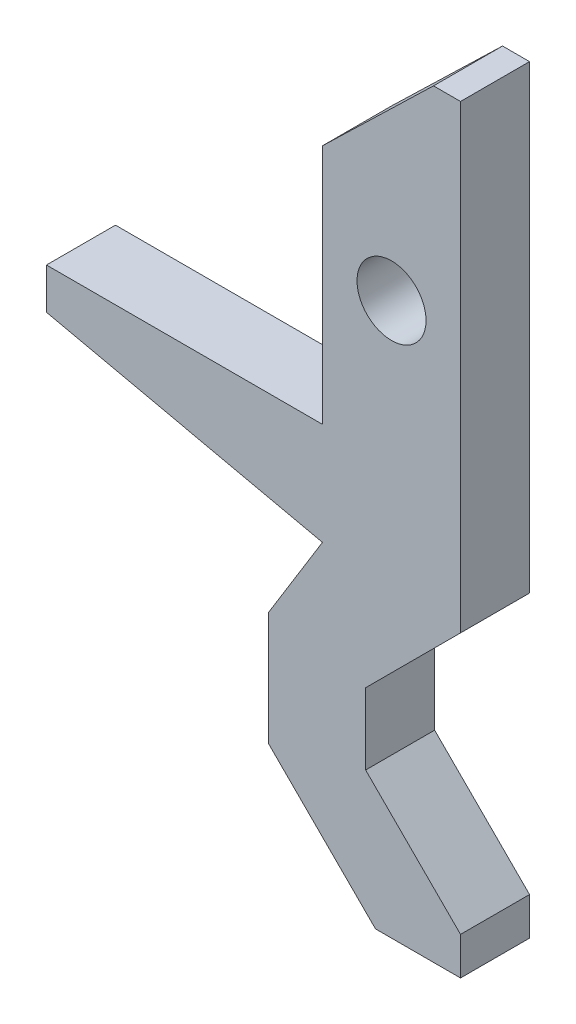
ISO-10303-21;
HEADER;
FILE_DESCRIPTION(('STEP AP214'),'2;1');
FILE_NAME('part.step','',(''),(''),'','','');
FILE_SCHEMA(('AUTOMOTIVE_DESIGN { 1 0 10303 214 1 1 1 1 }'));
ENDSEC;
DATA;
#1=APPLICATION_CONTEXT('core data for automotive mechanical design processes');
#2=APPLICATION_PROTOCOL_DEFINITION('international standard','automotive_design',2000,#1);
#3=PRODUCT_CONTEXT('',#1,'mechanical');
#4=PRODUCT('Part','Part','',(#3));
#5=PRODUCT_RELATED_PRODUCT_CATEGORY('part','',(#4));
#6=PRODUCT_DEFINITION_FORMATION('','',#4);
#7=PRODUCT_DEFINITION_CONTEXT('part definition',#1,'design');
#8=PRODUCT_DEFINITION('design','',#6,#7);
#9=PRODUCT_DEFINITION_SHAPE('','',#8);
#10=(LENGTH_UNIT() NAMED_UNIT(*) SI_UNIT(.MILLI.,.METRE.));
#11=(NAMED_UNIT(*) PLANE_ANGLE_UNIT() SI_UNIT($,.RADIAN.));
#12=(NAMED_UNIT(*) SI_UNIT($,.STERADIAN.) SOLID_ANGLE_UNIT());
#13=UNCERTAINTY_MEASURE_WITH_UNIT(LENGTH_MEASURE(1.E-05),#10,'distance_accuracy_value','');
#14=(GEOMETRIC_REPRESENTATION_CONTEXT(3) GLOBAL_UNCERTAINTY_ASSIGNED_CONTEXT((#13)) GLOBAL_UNIT_ASSIGNED_CONTEXT((#10,
#11,#12)) REPRESENTATION_CONTEXT('',''));
#15=CARTESIAN_POINT('',(0.,0.,0.));
#16=DIRECTION('',(0.,0.,1.));
#17=DIRECTION('',(1.,0.,0.));
#18=AXIS2_PLACEMENT_3D('',#15,#16,#17);
#19=CARTESIAN_POINT('',(-5.,0.,5.));
#20=DIRECTION('',(-1.,0.,0.));
#21=DIRECTION('',(0.,0.,1.));
#22=AXIS2_PLACEMENT_3D('',#19,#20,#21);
#23=PLANE('',#22);
#24=DIRECTION('',(0.,1.,0.));
#25=VECTOR('',#24,1.);
#26=CARTESIAN_POINT('',(-5.,0.,0.));
#27=LINE('',#26,#25);
#28=CARTESIAN_POINT('',(-5.,0.,0.));
#29=VERTEX_POINT('',#28);
#30=CARTESIAN_POINT('',(-5.,7.22018760925899,0.));
#31=VERTEX_POINT('',#30);
#32=EDGE_CURVE('E180',#29,#31,#27,.T.);
#33=ORIENTED_EDGE('',*,*,#32,.F.);
#34=DIRECTION('',(0.,0.,-1.));
#35=VECTOR('',#34,1.);
#36=CARTESIAN_POINT('',(-5.,0.,5.));
#37=LINE('',#36,#35);
#38=CARTESIAN_POINT('',(-5.,0.,5.));
#39=VERTEX_POINT('',#38);
#40=EDGE_CURVE('E11',#39,#29,#37,.T.);
#41=ORIENTED_EDGE('',*,*,#40,.F.);
#42=DIRECTION('',(0.,1.,0.));
#43=VECTOR('',#42,1.);
#44=CARTESIAN_POINT('',(-5.,0.,5.));
#45=LINE('',#44,#43);
#46=CARTESIAN_POINT('',(-5.,7.22018760925899,5.));
#47=VERTEX_POINT('',#46);
#48=EDGE_CURVE('E227',#39,#47,#45,.T.);
#49=ORIENTED_EDGE('',*,*,#48,.T.);
#50=DIRECTION('',(0.,0.,-1.));
#51=VECTOR('',#50,1.);
#52=CARTESIAN_POINT('',(-5.,7.22018760925899,5.));
#53=LINE('',#52,#51);
#54=EDGE_CURVE('E51',#47,#31,#53,.T.);
#55=ORIENTED_EDGE('',*,*,#54,.T.);
#56=EDGE_LOOP('',(#33,#41,#49,#55));
#57=FACE_BOUND('',#56,.T.);
#58=ADVANCED_FACE('F35',(#57),#23,.T.);
#59=CARTESIAN_POINT('',(-4.99999999680664,-0.000126359749041714,5.));
#60=DIRECTION('',(-0.999999999680664,-2.52719498164131E-05,0.));
#61=DIRECTION('',(2.52719498164131E-05,-0.999999999680664,0.));
#62=AXIS2_PLACEMENT_3D('',#59,#60,#61);
#63=PLANE('',#62);
#64=DIRECTION('',(-2.52719498164131E-05,0.999999999680664,0.));
#65=VECTOR('',#64,1.);
#66=CARTESIAN_POINT('',(-4.99999999680664,-0.000126359749041714,0.));
#67=LINE('',#66,#65);
#68=CARTESIAN_POINT('',(-4.99974066429336,-10.2618004720861,0.));
#69=VERTEX_POINT('',#68);
#70=EDGE_CURVE('E182',#69,#29,#67,.T.);
#71=ORIENTED_EDGE('',*,*,#70,.F.);
#72=DIRECTION('',(0.,0.,-1.));
#73=VECTOR('',#72,1.);
#74=CARTESIAN_POINT('',(-4.99974066429336,-10.2618004720861,5.));
#75=LINE('',#74,#73);
#76=CARTESIAN_POINT('',(-4.99974066429336,-10.2618004720861,5.));
#77=VERTEX_POINT('',#76);
#78=EDGE_CURVE('E43',#77,#69,#75,.T.);
#79=ORIENTED_EDGE('',*,*,#78,.F.);
#80=DIRECTION('',(-2.52719498164131E-05,0.999999999680664,0.));
#81=VECTOR('',#80,1.);
#82=CARTESIAN_POINT('',(-4.99999999680664,-0.000126359749041714,5.));
#83=LINE('',#82,#81);
#84=EDGE_CURVE('E273',#77,#39,#83,.T.);
#85=ORIENTED_EDGE('',*,*,#84,.T.);
#86=ORIENTED_EDGE('',*,*,#40,.T.);
#87=EDGE_LOOP('',(#71,#79,#85,#86));
#88=FACE_BOUND('',#87,.T.);
#89=ADVANCED_FACE('F260',(#88),#63,.T.);
#90=CARTESIAN_POINT('',(0.,-10.2618004720861,5.));
#91=DIRECTION('',(0.,1.,0.));
#92=DIRECTION('',(0.,0.,1.));
#93=AXIS2_PLACEMENT_3D('',#90,#91,#92);
#94=PLANE('',#93);
#95=DIRECTION('',(1.,0.,0.));
#96=VECTOR('',#95,1.);
#97=CARTESIAN_POINT('',(0.,-10.2618004720861,0.));
#98=LINE('',#97,#96);
#99=CARTESIAN_POINT('',(-25.,-10.2618004720861,0.));
#100=VERTEX_POINT('',#99);
#101=EDGE_CURVE('E185',#100,#69,#98,.T.);
#102=ORIENTED_EDGE('',*,*,#101,.F.);
#103=DIRECTION('',(0.,0.,-1.));
#104=VECTOR('',#103,1.);
#105=CARTESIAN_POINT('',(-25.,-10.2618004720861,5.));
#106=LINE('',#105,#104);
#107=CARTESIAN_POINT('',(-25.,-10.2618004720861,5.));
#108=VERTEX_POINT('',#107);
#109=EDGE_CURVE('E249',#108,#100,#106,.T.);
#110=ORIENTED_EDGE('',*,*,#109,.F.);
#111=DIRECTION('',(1.,0.,0.));
#112=VECTOR('',#111,1.);
#113=CARTESIAN_POINT('',(0.,-10.2618004720861,5.));
#114=LINE('',#113,#112);
#115=EDGE_CURVE('E256',#108,#77,#114,.T.);
#116=ORIENTED_EDGE('',*,*,#115,.T.);
#117=ORIENTED_EDGE('',*,*,#78,.T.);
#118=EDGE_LOOP('',(#102,#110,#116,#117));
#119=FACE_BOUND('',#118,.T.);
#120=ADVANCED_FACE('F254',(#119),#94,.T.);
#121=CARTESIAN_POINT('',(-25.,0.,5.));
#122=DIRECTION('',(-1.,0.,0.));
#123=DIRECTION('',(0.,0.,1.));
#124=AXIS2_PLACEMENT_3D('',#121,#122,#123);
#125=PLANE('',#124);
#126=DIRECTION('',(0.,1.,0.));
#127=VECTOR('',#126,1.);
#128=CARTESIAN_POINT('',(-25.,0.,0.));
#129=LINE('',#128,#127);
#130=CARTESIAN_POINT('',(-25.,-13.2318791793819,0.));
#131=VERTEX_POINT('',#130);
#132=EDGE_CURVE('E188',#131,#100,#129,.T.);
#133=ORIENTED_EDGE('',*,*,#132,.F.);
#134=DIRECTION('',(0.,0.,-1.));
#135=VECTOR('',#134,1.);
#136=CARTESIAN_POINT('',(-25.,-13.2318791793819,5.));
#137=LINE('',#136,#135);
#138=CARTESIAN_POINT('',(-25.,-13.2318791793819,5.));
#139=VERTEX_POINT('',#138);
#140=EDGE_CURVE('E247',#139,#131,#137,.T.);
#141=ORIENTED_EDGE('',*,*,#140,.F.);
#142=DIRECTION('',(0.,1.,0.));
#143=VECTOR('',#142,1.);
#144=CARTESIAN_POINT('',(-25.,0.,5.));
#145=LINE('',#144,#143);
#146=EDGE_CURVE('E270',#139,#108,#145,.T.);
#147=ORIENTED_EDGE('',*,*,#146,.T.);
#148=ORIENTED_EDGE('',*,*,#109,.T.);
#149=EDGE_LOOP('',(#133,#141,#147,#148));
#150=FACE_BOUND('',#149,.T.);
#151=ADVANCED_FACE('F267',(#150),#125,.T.);
#152=CARTESIAN_POINT('',(-3.96952153423936,-17.896524406075,5.));
#153=DIRECTION('',(-0.216541398827497,-0.976273436386462,0.));
#154=DIRECTION('',(0.976273436386462,-0.216541398827497,0.));
#155=AXIS2_PLACEMENT_3D('',#152,#153,#154);
#156=PLANE('',#155);
#157=DIRECTION('',(-0.976273436386462,0.216541398827497,0.));
#158=VECTOR('',#157,1.);
#159=CARTESIAN_POINT('',(-3.96952153423936,-17.896524406075,0.));
#160=LINE('',#159,#158);
#161=CARTESIAN_POINT('',(-5.00334076728683,-17.6672191166804,0.));
#162=VERTEX_POINT('',#161);
#163=EDGE_CURVE('E191',#162,#131,#160,.T.);
#164=ORIENTED_EDGE('',*,*,#163,.F.);
#165=DIRECTION('',(0.,0.,-1.));
#166=VECTOR('',#165,1.);
#167=CARTESIAN_POINT('',(-5.00334076728683,-17.6672191166804,5.));
#168=LINE('',#167,#166);
#169=CARTESIAN_POINT('',(-5.00334076728683,-17.6672191166804,5.));
#170=VERTEX_POINT('',#169);
#171=EDGE_CURVE('E245',#170,#162,#168,.T.);
#172=ORIENTED_EDGE('',*,*,#171,.F.);
#173=DIRECTION('',(-0.976273436386462,0.216541398827497,0.));
#174=VECTOR('',#173,1.);
#175=CARTESIAN_POINT('',(-3.96952153423936,-17.896524406075,5.));
#176=LINE('',#175,#174);
#177=EDGE_CURVE('E275',#170,#139,#176,.T.);
#178=ORIENTED_EDGE('',*,*,#177,.T.);
#179=ORIENTED_EDGE('',*,*,#140,.T.);
#180=EDGE_LOOP('',(#164,#172,#178,#179));
#181=FACE_BOUND('',#180,.T.);
#182=ADVANCED_FACE('F327',(#181),#156,.T.);
#183=CARTESIAN_POINT('',(4.25802567506609,-2.62091918045518,5.));
#184=DIRECTION('',(-0.85160513501322,0.524183836091038,0.));
#185=DIRECTION('',(-0.524183836091037,-0.85160513501322,0.));
#186=AXIS2_PLACEMENT_3D('',#183,#184,#185);
#187=PLANE('',#186);
#188=DIRECTION('',(0.524183836091038,0.85160513501322,0.));
#189=VECTOR('',#188,1.);
#190=CARTESIAN_POINT('',(4.25802567506609,-2.62091918045518,0.));
#191=LINE('',#190,#189);
#192=CARTESIAN_POINT('',(-8.91828726747819,-24.0275612587185,0.));
#193=VERTEX_POINT('',#192);
#194=EDGE_CURVE('E194',#193,#162,#191,.T.);
#195=ORIENTED_EDGE('',*,*,#194,.F.);
#196=DIRECTION('',(0.,0.,-1.));
#197=VECTOR('',#196,1.);
#198=CARTESIAN_POINT('',(-8.91828726747819,-24.0275612587185,5.));
#199=LINE('',#198,#197);
#200=CARTESIAN_POINT('',(-8.91828726747819,-24.0275612587185,5.));
#201=VERTEX_POINT('',#200);
#202=EDGE_CURVE('E243',#201,#193,#199,.T.);
#203=ORIENTED_EDGE('',*,*,#202,.F.);
#204=DIRECTION('',(0.524183836091038,0.85160513501322,0.));
#205=VECTOR('',#204,1.);
#206=CARTESIAN_POINT('',(4.25802567506609,-2.62091918045518,5.));
#207=LINE('',#206,#205);
#208=EDGE_CURVE('E281',#201,#170,#207,.T.);
#209=ORIENTED_EDGE('',*,*,#208,.T.);
#210=ORIENTED_EDGE('',*,*,#171,.T.);
#211=EDGE_LOOP('',(#195,#203,#209,#210));
#212=FACE_BOUND('',#211,.T.);
#213=ADVANCED_FACE('F330',(#212),#187,.T.);
#214=CARTESIAN_POINT('',(-8.91828726747819,0.,5.));
#215=DIRECTION('',(-1.,0.,0.));
#216=DIRECTION('',(0.,0.,1.));
#217=AXIS2_PLACEMENT_3D('',#214,#215,#216);
#218=PLANE('',#217);
#219=DIRECTION('',(0.,1.,0.));
#220=VECTOR('',#219,1.);
#221=CARTESIAN_POINT('',(-8.91828726747819,0.,0.));
#222=LINE('',#221,#220);
#223=CARTESIAN_POINT('',(-8.91828726747819,-32.2419583256633,0.));
#224=VERTEX_POINT('',#223);
#225=EDGE_CURVE('E197',#224,#193,#222,.T.);
#226=ORIENTED_EDGE('',*,*,#225,.F.);
#227=DIRECTION('',(0.,0.,-1.));
#228=VECTOR('',#227,1.);
#229=CARTESIAN_POINT('',(-8.91828726747819,-32.2419583256633,5.));
#230=LINE('',#229,#228);
#231=CARTESIAN_POINT('',(-8.91828726747819,-32.2419583256633,5.));
#232=VERTEX_POINT('',#231);
#233=EDGE_CURVE('E241',#232,#224,#230,.T.);
#234=ORIENTED_EDGE('',*,*,#233,.F.);
#235=DIRECTION('',(0.,1.,0.));
#236=VECTOR('',#235,1.);
#237=CARTESIAN_POINT('',(-8.91828726747819,0.,5.));
#238=LINE('',#237,#236);
#239=EDGE_CURVE('E284',#232,#201,#238,.T.);
#240=ORIENTED_EDGE('',*,*,#239,.T.);
#241=ORIENTED_EDGE('',*,*,#202,.T.);
#242=EDGE_LOOP('',(#226,#234,#240,#241));
#243=FACE_BOUND('',#242,.T.);
#244=ADVANCED_FACE('F334',(#243),#218,.T.);
#245=CARTESIAN_POINT('',(-20.5801227965708,-20.5801227965708,5.));
#246=DIRECTION('',(-0.707106781186548,-0.707106781186547,0.));
#247=DIRECTION('',(0.707106781186547,-0.707106781186548,0.));
#248=AXIS2_PLACEMENT_3D('',#245,#246,#247);
#249=PLANE('',#248);
#250=DIRECTION('',(-0.707106781186547,0.707106781186548,0.));
#251=VECTOR('',#250,1.);
#252=CARTESIAN_POINT('',(-20.5801227965708,-20.5801227965708,0.));
#253=LINE('',#252,#251);
#254=CARTESIAN_POINT('',(-1.16024559314153,-40.,0.));
#255=VERTEX_POINT('',#254);
#256=EDGE_CURVE('E200',#255,#224,#253,.T.);
#257=ORIENTED_EDGE('',*,*,#256,.F.);
#258=DIRECTION('',(0.,0.,-1.));
#259=VECTOR('',#258,1.);
#260=CARTESIAN_POINT('',(-1.16024559314153,-40.,5.));
#261=LINE('',#260,#259);
#262=CARTESIAN_POINT('',(-1.16024559314153,-40.,5.));
#263=VERTEX_POINT('',#262);
#264=EDGE_CURVE('E239',#263,#255,#261,.T.);
#265=ORIENTED_EDGE('',*,*,#264,.F.);
#266=DIRECTION('',(-0.707106781186547,0.707106781186548,0.));
#267=VECTOR('',#266,1.);
#268=CARTESIAN_POINT('',(-20.5801227965708,-20.5801227965708,5.));
#269=LINE('',#268,#267);
#270=EDGE_CURVE('E287',#263,#232,#269,.T.);
#271=ORIENTED_EDGE('',*,*,#270,.T.);
#272=ORIENTED_EDGE('',*,*,#233,.T.);
#273=EDGE_LOOP('',(#257,#265,#271,#272));
#274=FACE_BOUND('',#273,.T.);
#275=ADVANCED_FACE('F338',(#274),#249,.T.);
#276=CARTESIAN_POINT('',(0.,-40.,5.));
#277=DIRECTION('',(0.,-1.,0.));
#278=DIRECTION('',(0.,0.,-1.));
#279=AXIS2_PLACEMENT_3D('',#276,#277,#278);
#280=PLANE('',#279);
#281=DIRECTION('',(-1.,0.,0.));
#282=VECTOR('',#281,1.);
#283=CARTESIAN_POINT('',(0.,-40.,0.));
#284=LINE('',#283,#282);
#285=CARTESIAN_POINT('',(5.,-40.,0.));
#286=VERTEX_POINT('',#285);
#287=EDGE_CURVE('E203',#286,#255,#284,.T.);
#288=ORIENTED_EDGE('',*,*,#287,.F.);
#289=DIRECTION('',(0.,0.,-1.));
#290=VECTOR('',#289,1.);
#291=CARTESIAN_POINT('',(5.,-40.,5.));
#292=LINE('',#291,#290);
#293=CARTESIAN_POINT('',(5.,-40.,5.));
#294=VERTEX_POINT('',#293);
#295=EDGE_CURVE('E237',#294,#286,#292,.T.);
#296=ORIENTED_EDGE('',*,*,#295,.F.);
#297=DIRECTION('',(-1.,0.,0.));
#298=VECTOR('',#297,1.);
#299=CARTESIAN_POINT('',(0.,-40.,5.));
#300=LINE('',#299,#298);
#301=EDGE_CURVE('E290',#294,#263,#300,.T.);
#302=ORIENTED_EDGE('',*,*,#301,.T.);
#303=ORIENTED_EDGE('',*,*,#264,.T.);
#304=EDGE_LOOP('',(#288,#296,#302,#303));
#305=FACE_BOUND('',#304,.T.);
#306=ADVANCED_FACE('F342',(#305),#280,.T.);
#307=CARTESIAN_POINT('',(4.99999999999994,0.,5.));
#308=DIRECTION('',(1.,0.,0.));
#309=DIRECTION('',(0.,1.,0.));
#310=AXIS2_PLACEMENT_3D('',#307,#308,#309);
#311=PLANE('',#310);
#312=DIRECTION('',(0.,-1.,0.));
#313=VECTOR('',#312,1.);
#314=CARTESIAN_POINT('',(4.99999999999994,0.,0.));
#315=LINE('',#314,#313);
#316=CARTESIAN_POINT('',(5.,-37.2631212617562,0.));
#317=VERTEX_POINT('',#316);
#318=EDGE_CURVE('E206',#317,#286,#315,.T.);
#319=ORIENTED_EDGE('',*,*,#318,.F.);
#320=DIRECTION('',(0.,0.,-1.));
#321=VECTOR('',#320,1.);
#322=CARTESIAN_POINT('',(5.,-37.2631212617562,5.));
#323=LINE('',#322,#321);
#324=CARTESIAN_POINT('',(5.,-37.2631212617562,5.));
#325=VERTEX_POINT('',#324);
#326=EDGE_CURVE('E235',#325,#317,#323,.T.);
#327=ORIENTED_EDGE('',*,*,#326,.F.);
#328=DIRECTION('',(0.,-1.,0.));
#329=VECTOR('',#328,1.);
#330=CARTESIAN_POINT('',(4.99999999999994,0.,5.));
#331=LINE('',#330,#329);
#332=EDGE_CURVE('E293',#325,#294,#331,.T.);
#333=ORIENTED_EDGE('',*,*,#332,.T.);
#334=ORIENTED_EDGE('',*,*,#295,.T.);
#335=EDGE_LOOP('',(#319,#327,#333,#334));
#336=FACE_BOUND('',#335,.T.);
#337=ADVANCED_FACE('F346',(#336),#311,.T.);
#338=CARTESIAN_POINT('',(-16.1315606308782,-16.131560630879,5.));
#339=DIRECTION('',(0.70710678118653,0.707106781186565,0.));
#340=DIRECTION('',(-0.707106781186565,0.70710678118653,0.));
#341=AXIS2_PLACEMENT_3D('',#338,#339,#340);
#342=PLANE('',#341);
#343=DIRECTION('',(0.707106781186565,-0.70710678118653,0.));
#344=VECTOR('',#343,1.);
#345=CARTESIAN_POINT('',(-16.1315606308782,-16.131560630879,0.));
#346=LINE('',#345,#344);
#347=CARTESIAN_POINT('',(-1.87538447652522,-30.3877367852313,0.));
#348=VERTEX_POINT('',#347);
#349=EDGE_CURVE('E209',#348,#317,#346,.T.);
#350=ORIENTED_EDGE('',*,*,#349,.F.);
#351=DIRECTION('',(0.,0.,-1.));
#352=VECTOR('',#351,1.);
#353=CARTESIAN_POINT('',(-1.87538447652522,-30.3877367852313,5.));
#354=LINE('',#353,#352);
#355=CARTESIAN_POINT('',(-1.87538447652522,-30.3877367852313,5.));
#356=VERTEX_POINT('',#355);
#357=EDGE_CURVE('E233',#356,#348,#354,.T.);
#358=ORIENTED_EDGE('',*,*,#357,.F.);
#359=DIRECTION('',(0.707106781186565,-0.70710678118653,0.));
#360=VECTOR('',#359,1.);
#361=CARTESIAN_POINT('',(-16.1315606308782,-16.131560630879,5.));
#362=LINE('',#361,#360);
#363=EDGE_CURVE('E296',#356,#325,#362,.T.);
#364=ORIENTED_EDGE('',*,*,#363,.T.);
#365=ORIENTED_EDGE('',*,*,#326,.T.);
#366=EDGE_LOOP('',(#350,#358,#364,#365));
#367=FACE_BOUND('',#366,.T.);
#368=ADVANCED_FACE('F350',(#367),#342,.T.);
#369=CARTESIAN_POINT('',(-1.87538447652419,0.,5.));
#370=DIRECTION('',(1.,0.,0.));
#371=DIRECTION('',(0.,1.,0.));
#372=AXIS2_PLACEMENT_3D('',#369,#370,#371);
#373=PLANE('',#372);
#374=DIRECTION('',(0.,-1.,0.));
#375=VECTOR('',#374,1.);
#376=CARTESIAN_POINT('',(-1.87538447652419,0.,0.));
#377=LINE('',#376,#375);
#378=CARTESIAN_POINT('',(-1.87538447652504,-25.2235786470491,0.));
#379=VERTEX_POINT('',#378);
#380=EDGE_CURVE('E212',#379,#348,#377,.T.);
#381=ORIENTED_EDGE('',*,*,#380,.F.);
#382=DIRECTION('',(0.,0.,-1.));
#383=VECTOR('',#382,1.);
#384=CARTESIAN_POINT('',(-1.87538447652504,-25.2235786470491,5.));
#385=LINE('',#384,#383);
#386=CARTESIAN_POINT('',(-1.87538447652504,-25.2235786470491,5.));
#387=VERTEX_POINT('',#386);
#388=EDGE_CURVE('E231',#387,#379,#385,.T.);
#389=ORIENTED_EDGE('',*,*,#388,.F.);
#390=DIRECTION('',(0.,-1.,0.));
#391=VECTOR('',#390,1.);
#392=CARTESIAN_POINT('',(-1.87538447652419,0.,5.));
#393=LINE('',#392,#391);
#394=EDGE_CURVE('E299',#387,#356,#393,.T.);
#395=ORIENTED_EDGE('',*,*,#394,.T.);
#396=ORIENTED_EDGE('',*,*,#357,.T.);
#397=EDGE_LOOP('',(#381,#389,#395,#396));
#398=FACE_BOUND('',#397,.T.);
#399=ADVANCED_FACE('F354',(#398),#373,.T.);
#400=CARTESIAN_POINT('',(11.674097085262,-11.6740970852614,5.));
#401=DIRECTION('',(0.707106781186566,-0.707106781186529,0.));
#402=DIRECTION('',(0.707106781186529,0.707106781186566,0.));
#403=AXIS2_PLACEMENT_3D('',#400,#401,#402);
#404=PLANE('',#403);
#405=DIRECTION('',(-0.707106781186529,-0.707106781186566,0.));
#406=VECTOR('',#405,1.);
#407=CARTESIAN_POINT('',(11.674097085262,-11.6740970852614,0.));
#408=LINE('',#407,#406);
#409=CARTESIAN_POINT('',(5.,-18.3481941705238,0.));
#410=VERTEX_POINT('',#409);
#411=EDGE_CURVE('E215',#410,#379,#408,.T.);
#412=ORIENTED_EDGE('',*,*,#411,.F.);
#413=DIRECTION('',(0.,0.,-1.));
#414=VECTOR('',#413,1.);
#415=CARTESIAN_POINT('',(5.,-18.3481941705238,5.));
#416=LINE('',#415,#414);
#417=CARTESIAN_POINT('',(5.,-18.3481941705238,5.));
#418=VERTEX_POINT('',#417);
#419=EDGE_CURVE('E158',#418,#410,#416,.T.);
#420=ORIENTED_EDGE('',*,*,#419,.F.);
#421=DIRECTION('',(-0.707106781186529,-0.707106781186566,0.));
#422=VECTOR('',#421,1.);
#423=CARTESIAN_POINT('',(11.674097085262,-11.6740970852614,5.));
#424=LINE('',#423,#422);
#425=EDGE_CURVE('E169',#418,#387,#424,.T.);
#426=ORIENTED_EDGE('',*,*,#425,.T.);
#427=ORIENTED_EDGE('',*,*,#388,.T.);
#428=EDGE_LOOP('',(#412,#420,#426,#427));
#429=FACE_BOUND('',#428,.T.);
#430=ADVANCED_FACE('F303',(#429),#404,.T.);
#431=CARTESIAN_POINT('',(5.,0.,5.));
#432=DIRECTION('',(1.,0.,0.));
#433=DIRECTION('',(0.,1.,0.));
#434=AXIS2_PLACEMENT_3D('',#431,#432,#433);
#435=PLANE('',#434);
#436=DIRECTION('',(0.,-1.,0.));
#437=VECTOR('',#436,1.);
#438=CARTESIAN_POINT('',(5.,0.,0.));
#439=LINE('',#438,#437);
#440=CARTESIAN_POINT('',(5.,15.,0.));
#441=VERTEX_POINT('',#440);
#442=EDGE_CURVE('E154',#441,#410,#439,.T.);
#443=ORIENTED_EDGE('',*,*,#442,.F.);
#444=DIRECTION('',(0.,0.,-1.));
#445=VECTOR('',#444,1.);
#446=CARTESIAN_POINT('',(5.,15.,5.));
#447=LINE('',#446,#445);
#448=CARTESIAN_POINT('',(5.,15.,5.));
#449=VERTEX_POINT('',#448);
#450=EDGE_CURVE('E149',#449,#441,#447,.T.);
#451=ORIENTED_EDGE('',*,*,#450,.F.);
#452=DIRECTION('',(0.,-1.,0.));
#453=VECTOR('',#452,1.);
#454=CARTESIAN_POINT('',(5.,0.,5.));
#455=LINE('',#454,#453);
#456=EDGE_CURVE('E152',#449,#418,#455,.T.);
#457=ORIENTED_EDGE('',*,*,#456,.T.);
#458=ORIENTED_EDGE('',*,*,#419,.T.);
#459=EDGE_LOOP('',(#443,#451,#457,#458));
#460=FACE_BOUND('',#459,.T.);
#461=ADVANCED_FACE('F151',(#460),#435,.T.);
#462=CARTESIAN_POINT('',(0.,15.,5.));
#463=DIRECTION('',(0.,1.,0.));
#464=DIRECTION('',(0.,0.,1.));
#465=AXIS2_PLACEMENT_3D('',#462,#463,#464);
#466=PLANE('',#465);
#467=DIRECTION('',(1.,0.,0.));
#468=VECTOR('',#467,1.);
#469=CARTESIAN_POINT('',(0.,15.,0.));
#470=LINE('',#469,#468);
#471=CARTESIAN_POINT('',(3.04249303146178,15.,0.));
#472=VERTEX_POINT('',#471);
#473=EDGE_CURVE('E219',#472,#441,#470,.T.);
#474=ORIENTED_EDGE('',*,*,#473,.F.);
#475=DIRECTION('',(0.,0.,-1.));
#476=VECTOR('',#475,1.);
#477=CARTESIAN_POINT('',(3.04249303146178,15.,5.));
#478=LINE('',#477,#476);
#479=CARTESIAN_POINT('',(3.04249303146178,15.,5.));
#480=VERTEX_POINT('',#479);
#481=EDGE_CURVE('E100',#480,#472,#478,.T.);
#482=ORIENTED_EDGE('',*,*,#481,.F.);
#483=DIRECTION('',(1.,0.,0.));
#484=VECTOR('',#483,1.);
#485=CARTESIAN_POINT('',(0.,15.,5.));
#486=LINE('',#485,#484);
#487=EDGE_CURVE('E166',#480,#449,#486,.T.);
#488=ORIENTED_EDGE('',*,*,#487,.T.);
#489=ORIENTED_EDGE('',*,*,#450,.T.);
#490=EDGE_LOOP('',(#474,#482,#488,#489));
#491=FACE_BOUND('',#490,.T.);
#492=ADVANCED_FACE('F171',(#491),#466,.T.);
#493=CARTESIAN_POINT('',(-6.02511757361455,6.22855200945502,5.));
#494=DIRECTION('',(-0.695271641256095,0.718747065987094,0.));
#495=DIRECTION('',(-0.718747065987094,-0.695271641256095,0.));
#496=AXIS2_PLACEMENT_3D('',#493,#494,#495);
#497=PLANE('',#496);
#498=DIRECTION('',(0.718747065987094,0.695271641256095,0.));
#499=VECTOR('',#498,1.);
#500=CARTESIAN_POINT('',(-6.02511757361455,6.22855200945502,0.));
#501=LINE('',#500,#499);
#502=EDGE_CURVE('E221',#31,#472,#501,.T.);
#503=ORIENTED_EDGE('',*,*,#502,.F.);
#504=ORIENTED_EDGE('',*,*,#54,.F.);
#505=DIRECTION('',(0.718747065987094,0.695271641256095,0.));
#506=VECTOR('',#505,1.);
#507=CARTESIAN_POINT('',(-6.02511757361455,6.22855200945502,5.));
#508=LINE('',#507,#506);
#509=EDGE_CURVE('E172',#47,#480,#508,.T.);
#510=ORIENTED_EDGE('',*,*,#509,.T.);
#511=ORIENTED_EDGE('',*,*,#481,.T.);
#512=EDGE_LOOP('',(#503,#504,#510,#511));
#513=FACE_BOUND('',#512,.T.);
#514=ADVANCED_FACE('F305',(#513),#497,.T.);
#515=CARTESIAN_POINT('',(0.,0.,5.));
#516=DIRECTION('',(0.,0.,-1.));
#517=DIRECTION('',(-1.,0.,0.));
#518=AXIS2_PLACEMENT_3D('',#515,#516,#517);
#519=CYLINDRICAL_SURFACE('',#518,2.5);
#520=CARTESIAN_POINT('',(0.,0.,5.));
#521=DIRECTION('',(0.,0.,1.));
#522=DIRECTION('',(1.,0.,0.));
#523=AXIS2_PLACEMENT_3D('',#520,#521,#522);
#524=CIRCLE('',#523,2.5);
#525=CARTESIAN_POINT('',(2.5,0.,5.));
#526=VERTEX_POINT('',#525);
#527=EDGE_CURVE('E174',#526,#526,#524,.T.);
#528=ORIENTED_EDGE('',*,*,#527,.T.);
#529=EDGE_LOOP('',(#528));
#530=FACE_BOUND('',#529,.T.);
#531=CARTESIAN_POINT('',(0.,0.,0.));
#532=DIRECTION('',(0.,0.,1.));
#533=DIRECTION('',(1.,0.,0.));
#534=AXIS2_PLACEMENT_3D('',#531,#532,#533);
#535=CIRCLE('',#534,2.5);
#536=CARTESIAN_POINT('',(2.5,0.,0.));
#537=VERTEX_POINT('',#536);
#538=EDGE_CURVE('E224',#537,#537,#535,.T.);
#539=ORIENTED_EDGE('',*,*,#538,.F.);
#540=EDGE_LOOP('',(#539));
#541=FACE_BOUND('',#540,.T.);
#542=ADVANCED_FACE('F307',(#530,#541),#519,.F.);
#543=CARTESIAN_POINT('',(0.,0.,5.));
#544=DIRECTION('',(0.,0.,1.));
#545=DIRECTION('',(1.,0.,0.));
#546=AXIS2_PLACEMENT_3D('',#543,#544,#545);
#547=PLANE('',#546);
#548=ORIENTED_EDGE('',*,*,#48,.F.);
#549=ORIENTED_EDGE('',*,*,#84,.F.);
#550=ORIENTED_EDGE('',*,*,#115,.F.);
#551=ORIENTED_EDGE('',*,*,#146,.F.);
#552=ORIENTED_EDGE('',*,*,#177,.F.);
#553=ORIENTED_EDGE('',*,*,#208,.F.);
#554=ORIENTED_EDGE('',*,*,#239,.F.);
#555=ORIENTED_EDGE('',*,*,#270,.F.);
#556=ORIENTED_EDGE('',*,*,#301,.F.);
#557=ORIENTED_EDGE('',*,*,#332,.F.);
#558=ORIENTED_EDGE('',*,*,#363,.F.);
#559=ORIENTED_EDGE('',*,*,#394,.F.);
#560=ORIENTED_EDGE('',*,*,#425,.F.);
#561=ORIENTED_EDGE('',*,*,#456,.F.);
#562=ORIENTED_EDGE('',*,*,#487,.F.);
#563=ORIENTED_EDGE('',*,*,#509,.F.);
#564=EDGE_LOOP('',(#548,#549,#550,#551,#552,#553,#554,#555,#556,#557,#558,#559,#560,#561,#562,#563));
#565=FACE_BOUND('',#564,.T.);
#566=ORIENTED_EDGE('',*,*,#527,.F.);
#567=EDGE_LOOP('',(#566));
#568=FACE_BOUND('',#567,.T.);
#569=ADVANCED_FACE('F163',(#565,#568),#547,.T.);
#570=CARTESIAN_POINT('',(0.,0.,0.));
#571=DIRECTION('',(0.,0.,1.));
#572=DIRECTION('',(1.,0.,0.));
#573=AXIS2_PLACEMENT_3D('',#570,#571,#572);
#574=PLANE('',#573);
#575=ORIENTED_EDGE('',*,*,#32,.T.);
#576=ORIENTED_EDGE('',*,*,#502,.T.);
#577=ORIENTED_EDGE('',*,*,#473,.T.);
#578=ORIENTED_EDGE('',*,*,#442,.T.);
#579=ORIENTED_EDGE('',*,*,#411,.T.);
#580=ORIENTED_EDGE('',*,*,#380,.T.);
#581=ORIENTED_EDGE('',*,*,#349,.T.);
#582=ORIENTED_EDGE('',*,*,#318,.T.);
#583=ORIENTED_EDGE('',*,*,#287,.T.);
#584=ORIENTED_EDGE('',*,*,#256,.T.);
#585=ORIENTED_EDGE('',*,*,#225,.T.);
#586=ORIENTED_EDGE('',*,*,#194,.T.);
#587=ORIENTED_EDGE('',*,*,#163,.T.);
#588=ORIENTED_EDGE('',*,*,#132,.T.);
#589=ORIENTED_EDGE('',*,*,#101,.T.);
#590=ORIENTED_EDGE('',*,*,#70,.T.);
#591=EDGE_LOOP('',(#575,#576,#577,#578,#579,#580,#581,#582,#583,#584,#585,#586,#587,#588,#589,#590));
#592=FACE_BOUND('',#591,.T.);
#593=ORIENTED_EDGE('',*,*,#538,.T.);
#594=EDGE_LOOP('',(#593));
#595=FACE_BOUND('',#594,.T.);
#596=ADVANCED_FACE('F262',(#592,#595),#574,.F.);
#597=CLOSED_SHELL('',(#58,#89,#120,#151,#182,#213,#244,#275,#306,#337,#368,#399,#430,#461,#492,
#514,#542,#569,#596));
#598=MANIFOLD_SOLID_BREP('B2',#597);
#599=ADVANCED_BREP_SHAPE_REPRESENTATION('',(#18,#598),#14);
#600=SHAPE_DEFINITION_REPRESENTATION(#9,#599);
ENDSEC;
END-ISO-10303-21;
